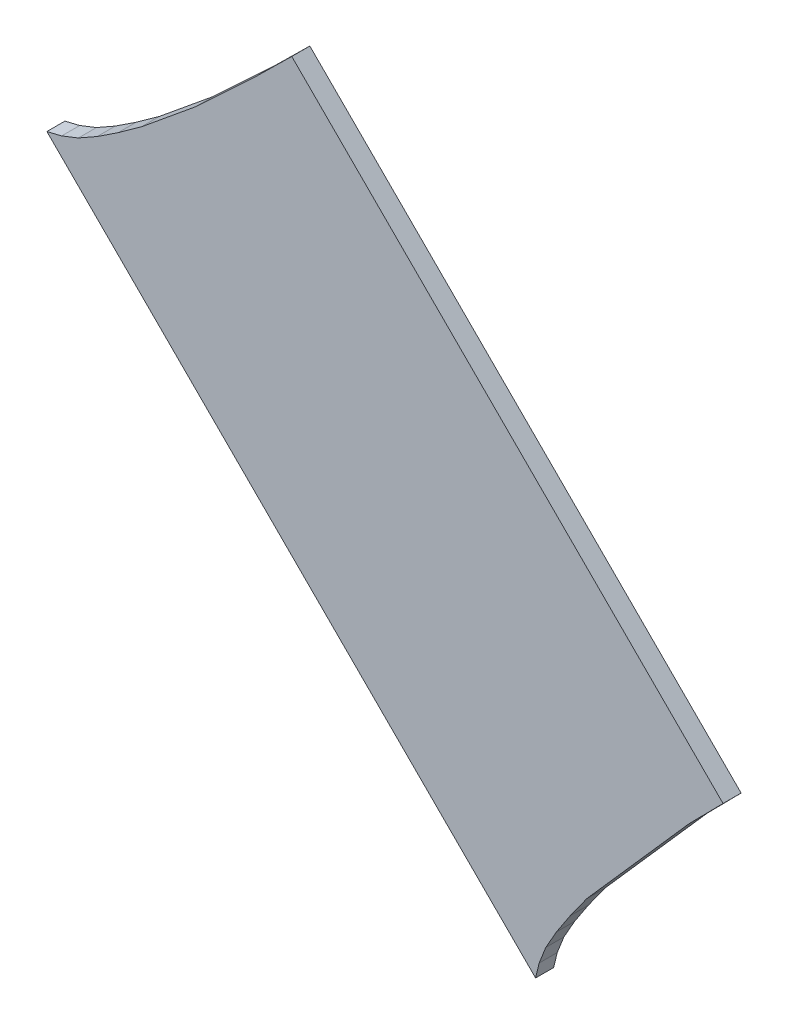
ISO-10303-21;
HEADER;
FILE_DESCRIPTION(('STEP AP214'),'2;1');
FILE_NAME('part.step','',(''),(''),'','','');
FILE_SCHEMA(('AUTOMOTIVE_DESIGN { 1 0 10303 214 1 1 1 1 }'));
ENDSEC;
DATA;
#1=APPLICATION_CONTEXT('core data for automotive mechanical design processes');
#2=APPLICATION_PROTOCOL_DEFINITION('international standard','automotive_design',2000,#1);
#3=PRODUCT_CONTEXT('',#1,'mechanical');
#4=PRODUCT('Part','Part','',(#3));
#5=PRODUCT_RELATED_PRODUCT_CATEGORY('part','',(#4));
#6=PRODUCT_DEFINITION_FORMATION('','',#4);
#7=PRODUCT_DEFINITION_CONTEXT('part definition',#1,'design');
#8=PRODUCT_DEFINITION('design','',#6,#7);
#9=PRODUCT_DEFINITION_SHAPE('','',#8);
#10=(LENGTH_UNIT() NAMED_UNIT(*) SI_UNIT(.MILLI.,.METRE.));
#11=(NAMED_UNIT(*) PLANE_ANGLE_UNIT() SI_UNIT($,.RADIAN.));
#12=(NAMED_UNIT(*) SI_UNIT($,.STERADIAN.) SOLID_ANGLE_UNIT());
#13=UNCERTAINTY_MEASURE_WITH_UNIT(LENGTH_MEASURE(1.E-05),#10,'distance_accuracy_value','');
#14=(GEOMETRIC_REPRESENTATION_CONTEXT(3) GLOBAL_UNCERTAINTY_ASSIGNED_CONTEXT((#13)) GLOBAL_UNIT_ASSIGNED_CONTEXT((#10,
#11,#12)) REPRESENTATION_CONTEXT('',''));
#15=CARTESIAN_POINT('',(0.,0.,0.));
#16=DIRECTION('',(0.,0.,1.));
#17=DIRECTION('',(1.,0.,0.));
#18=AXIS2_PLACEMENT_3D('',#15,#16,#17);
#19=CARTESIAN_POINT('',(117.662002563477,73.1510009765625,0.));
#20=DIRECTION('',(0.701852680042072,-0.712322129038373,0.));
#21=DIRECTION('',(-0.712322129038373,-0.701852680042072,0.));
#22=AXIS2_PLACEMENT_3D('',#19,#20,#21);
#23=PLANE('',#22);
#24=DIRECTION('',(-0.712322129038373,-0.701852680042072,0.));
#25=VECTOR('',#24,1.);
#26=CARTESIAN_POINT('',(117.662002563477,73.1510009765625,0.03556));
#27=LINE('',#26,#25);
#28=CARTESIAN_POINT('',(117.662002563477,73.1510009765625,0.03556));
#29=VERTEX_POINT('',#28);
#30=CARTESIAN_POINT('',(117.59400177002,73.0839996337891,0.03556));
#31=VERTEX_POINT('',#30);
#32=EDGE_CURVE('E11',#29,#31,#27,.T.);
#33=ORIENTED_EDGE('',*,*,#32,.F.);
#34=DIRECTION('',(0.,0.,1.));
#35=VECTOR('',#34,1.);
#36=CARTESIAN_POINT('',(117.662002563477,73.1510009765625,0.));
#37=LINE('',#36,#35);
#38=CARTESIAN_POINT('',(117.662002563477,73.1510009765625,0.));
#39=VERTEX_POINT('',#38);
#40=EDGE_CURVE('E24',#39,#29,#37,.T.);
#41=ORIENTED_EDGE('',*,*,#40,.F.);
#42=DIRECTION('',(-0.712322129038373,-0.701852680042072,0.));
#43=VECTOR('',#42,1.);
#44=CARTESIAN_POINT('',(117.662002563477,73.1510009765625,0.));
#45=LINE('',#44,#43);
#46=CARTESIAN_POINT('',(117.59400177002,73.0839996337891,0.));
#47=VERTEX_POINT('',#46);
#48=EDGE_CURVE('E154',#39,#47,#45,.T.);
#49=ORIENTED_EDGE('',*,*,#48,.T.);
#50=DIRECTION('',(0.,0.,1.));
#51=VECTOR('',#50,1.);
#52=CARTESIAN_POINT('',(117.59400177002,73.0839996337891,0.));
#53=LINE('',#52,#51);
#54=EDGE_CURVE('E37',#47,#31,#53,.T.);
#55=ORIENTED_EDGE('',*,*,#54,.T.);
#56=EDGE_LOOP('',(#33,#41,#49,#55));
#57=FACE_BOUND('',#56,.T.);
#58=ADVANCED_FACE('F17',(#57),#23,.F.);
#59=CARTESIAN_POINT('',(117.59400177002,73.0839996337891,0.));
#60=DIRECTION('',(0.682734905696,-0.730666167647219,0.));
#61=DIRECTION('',(-0.730666167647219,-0.682734905696,0.));
#62=AXIS2_PLACEMENT_3D('',#59,#60,#61);
#63=PLANE('',#62);
#64=DIRECTION('',(-0.730666167647219,-0.682734905696,0.));
#65=VECTOR('',#64,1.);
#66=CARTESIAN_POINT('',(117.59400177002,73.0839996337891,0.03556));
#67=LINE('',#66,#65);
#68=CARTESIAN_POINT('',(117.47200012207,72.9700012207031,0.03556));
#69=VERTEX_POINT('',#68);
#70=EDGE_CURVE('E266',#31,#69,#67,.T.);
#71=ORIENTED_EDGE('',*,*,#70,.F.);
#72=ORIENTED_EDGE('',*,*,#54,.F.);
#73=DIRECTION('',(-0.730666167647219,-0.682734905696,0.));
#74=VECTOR('',#73,1.);
#75=CARTESIAN_POINT('',(117.59400177002,73.0839996337891,0.));
#76=LINE('',#75,#74);
#77=CARTESIAN_POINT('',(117.47200012207,72.9700012207031,0.));
#78=VERTEX_POINT('',#77);
#79=EDGE_CURVE('E263',#47,#78,#76,.T.);
#80=ORIENTED_EDGE('',*,*,#79,.T.);
#81=DIRECTION('',(0.,0.,1.));
#82=VECTOR('',#81,1.);
#83=CARTESIAN_POINT('',(117.47200012207,72.9700012207031,0.));
#84=LINE('',#83,#82);
#85=EDGE_CURVE('E261',#78,#69,#84,.T.);
#86=ORIENTED_EDGE('',*,*,#85,.T.);
#87=EDGE_LOOP('',(#71,#72,#80,#86));
#88=FACE_BOUND('',#87,.T.);
#89=ADVANCED_FACE('F274',(#88),#63,.F.);
#90=CARTESIAN_POINT('',(117.47200012207,72.9700012207031,0.));
#91=DIRECTION('',(0.634409536658508,-0.772997114998974,0.));
#92=DIRECTION('',(-0.772997114998974,-0.634409536658508,0.));
#93=AXIS2_PLACEMENT_3D('',#90,#91,#92);
#94=PLANE('',#93);
#95=DIRECTION('',(-0.772997114998974,-0.634409536658508,0.));
#96=VECTOR('',#95,1.);
#97=CARTESIAN_POINT('',(117.47200012207,72.9700012207031,0.03556));
#98=LINE('',#97,#96);
#99=CARTESIAN_POINT('',(117.365997314453,72.8830032348633,0.03556));
#100=VERTEX_POINT('',#99);
#101=EDGE_CURVE('E258',#69,#100,#98,.T.);
#102=ORIENTED_EDGE('',*,*,#101,.F.);
#103=ORIENTED_EDGE('',*,*,#85,.F.);
#104=DIRECTION('',(-0.772997114998974,-0.634409536658508,0.));
#105=VECTOR('',#104,1.);
#106=CARTESIAN_POINT('',(117.47200012207,72.9700012207031,0.));
#107=LINE('',#106,#105);
#108=CARTESIAN_POINT('',(117.365997314453,72.8830032348633,0.));
#109=VERTEX_POINT('',#108);
#110=EDGE_CURVE('E255',#78,#109,#107,.T.);
#111=ORIENTED_EDGE('',*,*,#110,.T.);
#112=DIRECTION('',(0.,0.,1.));
#113=VECTOR('',#112,1.);
#114=CARTESIAN_POINT('',(117.365997314453,72.8830032348633,0.));
#115=LINE('',#114,#113);
#116=EDGE_CURVE('E253',#109,#100,#115,.T.);
#117=ORIENTED_EDGE('',*,*,#116,.T.);
#118=EDGE_LOOP('',(#102,#103,#111,#117));
#119=FACE_BOUND('',#118,.T.);
#120=ADVANCED_FACE('F280',(#119),#94,.F.);
#121=CARTESIAN_POINT('',(117.365997314453,72.8830032348633,0.));
#122=DIRECTION('',(0.582983306396356,-0.812484131822384,0.));
#123=DIRECTION('',(-0.812484131822384,-0.582983306396356,0.));
#124=AXIS2_PLACEMENT_3D('',#121,#122,#123);
#125=PLANE('',#124);
#126=DIRECTION('',(-0.812484131822384,-0.582983306396356,0.));
#127=VECTOR('',#126,1.);
#128=CARTESIAN_POINT('',(117.365997314453,72.8830032348633,0.03556));
#129=LINE('',#128,#127);
#130=CARTESIAN_POINT('',(117.319999694824,72.8499984741211,0.03556));
#131=VERTEX_POINT('',#130);
#132=EDGE_CURVE('E250',#100,#131,#129,.T.);
#133=ORIENTED_EDGE('',*,*,#132,.F.);
#134=ORIENTED_EDGE('',*,*,#116,.F.);
#135=DIRECTION('',(-0.812484131822384,-0.582983306396356,0.));
#136=VECTOR('',#135,1.);
#137=CARTESIAN_POINT('',(117.365997314453,72.8830032348633,0.));
#138=LINE('',#137,#136);
#139=CARTESIAN_POINT('',(117.319999694824,72.8499984741211,0.));
#140=VERTEX_POINT('',#139);
#141=EDGE_CURVE('E247',#109,#140,#138,.T.);
#142=ORIENTED_EDGE('',*,*,#141,.T.);
#143=DIRECTION('',(0.,0.,1.));
#144=VECTOR('',#143,1.);
#145=CARTESIAN_POINT('',(117.319999694824,72.8499984741211,0.));
#146=LINE('',#145,#144);
#147=EDGE_CURVE('E245',#140,#131,#146,.T.);
#148=ORIENTED_EDGE('',*,*,#147,.T.);
#149=EDGE_LOOP('',(#133,#134,#142,#148));
#150=FACE_BOUND('',#149,.T.);
#151=ADVANCED_FACE('F282',(#150),#125,.F.);
#152=CARTESIAN_POINT('',(117.319999694824,72.8499984741211,0.));
#153=DIRECTION('',(0.549993213403991,-0.835169123716599,0.));
#154=DIRECTION('',(-0.835169123716599,-0.549993213403991,0.));
#155=AXIS2_PLACEMENT_3D('',#152,#153,#154);
#156=PLANE('',#155);
#157=DIRECTION('',(-0.835169123716599,-0.549993213403991,0.));
#158=VECTOR('',#157,1.);
#159=CARTESIAN_POINT('',(117.319999694824,72.8499984741211,0.03556));
#160=LINE('',#159,#158);
#161=CARTESIAN_POINT('',(117.278999328613,72.822998046875,0.03556));
#162=VERTEX_POINT('',#161);
#163=EDGE_CURVE('E242',#131,#162,#160,.T.);
#164=ORIENTED_EDGE('',*,*,#163,.F.);
#165=ORIENTED_EDGE('',*,*,#147,.F.);
#166=DIRECTION('',(-0.835169123716599,-0.549993213403991,0.));
#167=VECTOR('',#166,1.);
#168=CARTESIAN_POINT('',(117.319999694824,72.8499984741211,0.));
#169=LINE('',#168,#167);
#170=CARTESIAN_POINT('',(117.278999328613,72.822998046875,0.));
#171=VERTEX_POINT('',#170);
#172=EDGE_CURVE('E239',#140,#171,#169,.T.);
#173=ORIENTED_EDGE('',*,*,#172,.T.);
#174=DIRECTION('',(0.,0.,1.));
#175=VECTOR('',#174,1.);
#176=CARTESIAN_POINT('',(117.278999328613,72.822998046875,0.));
#177=LINE('',#176,#175);
#178=EDGE_CURVE('E237',#171,#162,#177,.T.);
#179=ORIENTED_EDGE('',*,*,#178,.T.);
#180=EDGE_LOOP('',(#164,#165,#173,#179));
#181=FACE_BOUND('',#180,.T.);
#182=ADVANCED_FACE('F287',(#181),#156,.F.);
#183=CARTESIAN_POINT('',(117.278999328613,72.822998046875,0.));
#184=DIRECTION('',(0.49351020523534,-0.869740005592805,0.));
#185=DIRECTION('',(-0.869740005592805,-0.49351020523534,0.));
#186=AXIS2_PLACEMENT_3D('',#183,#184,#185);
#187=PLANE('',#186);
#188=DIRECTION('',(-0.869740005592805,-0.49351020523534,0.));
#189=VECTOR('',#188,1.);
#190=CARTESIAN_POINT('',(117.278999328613,72.822998046875,0.03556));
#191=LINE('',#190,#189);
#192=CARTESIAN_POINT('',(117.241996765137,72.802001953125,0.03556));
#193=VERTEX_POINT('',#192);
#194=EDGE_CURVE('E234',#162,#193,#191,.T.);
#195=ORIENTED_EDGE('',*,*,#194,.F.);
#196=ORIENTED_EDGE('',*,*,#178,.F.);
#197=DIRECTION('',(-0.869740005592805,-0.49351020523534,0.));
#198=VECTOR('',#197,1.);
#199=CARTESIAN_POINT('',(117.278999328613,72.822998046875,0.));
#200=LINE('',#199,#198);
#201=CARTESIAN_POINT('',(117.241996765137,72.802001953125,0.));
#202=VERTEX_POINT('',#201);
#203=EDGE_CURVE('E231',#171,#202,#200,.T.);
#204=ORIENTED_EDGE('',*,*,#203,.T.);
#205=DIRECTION('',(0.,0.,1.));
#206=VECTOR('',#205,1.);
#207=CARTESIAN_POINT('',(117.241996765137,72.802001953125,0.));
#208=LINE('',#207,#206);
#209=EDGE_CURVE('E229',#202,#193,#208,.T.);
#210=ORIENTED_EDGE('',*,*,#209,.T.);
#211=EDGE_LOOP('',(#195,#196,#204,#210));
#212=FACE_BOUND('',#211,.T.);
#213=ADVANCED_FACE('F290',(#212),#187,.F.);
#214=CARTESIAN_POINT('',(117.241996765137,72.802001953125,0.));
#215=DIRECTION('',(0.366564019369772,-0.93039283085344,0.));
#216=DIRECTION('',(-0.93039283085344,-0.366564019369772,0.));
#217=AXIS2_PLACEMENT_3D('',#214,#215,#216);
#218=PLANE('',#217);
#219=DIRECTION('',(-0.93039283085344,-0.366564019369772,0.));
#220=VECTOR('',#219,1.);
#221=CARTESIAN_POINT('',(117.241996765137,72.802001953125,0.03556));
#222=LINE('',#221,#220);
#223=CARTESIAN_POINT('',(117.208999633789,72.7890014648438,0.03556));
#224=VERTEX_POINT('',#223);
#225=EDGE_CURVE('E226',#193,#224,#222,.T.);
#226=ORIENTED_EDGE('',*,*,#225,.F.);
#227=ORIENTED_EDGE('',*,*,#209,.F.);
#228=DIRECTION('',(-0.93039283085344,-0.366564019369772,0.));
#229=VECTOR('',#228,1.);
#230=CARTESIAN_POINT('',(117.241996765137,72.802001953125,0.));
#231=LINE('',#230,#229);
#232=CARTESIAN_POINT('',(117.208999633789,72.7890014648438,0.));
#233=VERTEX_POINT('',#232);
#234=EDGE_CURVE('E223',#202,#233,#231,.T.);
#235=ORIENTED_EDGE('',*,*,#234,.T.);
#236=DIRECTION('',(0.,0.,1.));
#237=VECTOR('',#236,1.);
#238=CARTESIAN_POINT('',(117.208999633789,72.7890014648438,0.));
#239=LINE('',#238,#237);
#240=EDGE_CURVE('E221',#233,#224,#239,.T.);
#241=ORIENTED_EDGE('',*,*,#240,.T.);
#242=EDGE_LOOP('',(#226,#227,#235,#241));
#243=FACE_BOUND('',#242,.T.);
#244=ADVANCED_FACE('F295',(#243),#218,.F.);
#245=CARTESIAN_POINT('',(117.208999633789,72.7890014648438,0.));
#246=DIRECTION('',(0.234765525660795,-0.972052029451722,0.));
#247=DIRECTION('',(-0.972052029451722,-0.234765525660795,0.));
#248=AXIS2_PLACEMENT_3D('',#245,#246,#247);
#249=PLANE('',#248);
#250=DIRECTION('',(-0.972052029451722,-0.234765525660795,0.));
#251=VECTOR('',#250,1.);
#252=CARTESIAN_POINT('',(117.208999633789,72.7890014648438,0.03556));
#253=LINE('',#252,#251);
#254=CARTESIAN_POINT('',(117.180000305176,72.7819976806641,0.03556));
#255=VERTEX_POINT('',#254);
#256=EDGE_CURVE('E218',#224,#255,#253,.T.);
#257=ORIENTED_EDGE('',*,*,#256,.F.);
#258=ORIENTED_EDGE('',*,*,#240,.F.);
#259=DIRECTION('',(-0.972052029451722,-0.234765525660795,0.));
#260=VECTOR('',#259,1.);
#261=CARTESIAN_POINT('',(117.208999633789,72.7890014648438,0.));
#262=LINE('',#261,#260);
#263=CARTESIAN_POINT('',(117.180000305176,72.7819976806641,0.));
#264=VERTEX_POINT('',#263);
#265=EDGE_CURVE('E215',#233,#264,#262,.T.);
#266=ORIENTED_EDGE('',*,*,#265,.T.);
#267=DIRECTION('',(0.,0.,1.));
#268=VECTOR('',#267,1.);
#269=CARTESIAN_POINT('',(117.180000305176,72.7819976806641,0.));
#270=LINE('',#269,#268);
#271=EDGE_CURVE('E213',#264,#255,#270,.T.);
#272=ORIENTED_EDGE('',*,*,#271,.T.);
#273=EDGE_LOOP('',(#257,#258,#266,#272));
#274=FACE_BOUND('',#273,.T.);
#275=ADVANCED_FACE('F298',(#274),#249,.F.);
#276=CARTESIAN_POINT('',(117.180000305176,72.7819976806641,0.));
#277=DIRECTION('',(0.707106781186548,0.707106781186548,0.));
#278=DIRECTION('',(0.707106781186548,-0.707106781186548,0.));
#279=AXIS2_PLACEMENT_3D('',#276,#277,#278);
#280=PLANE('',#279);
#281=DIRECTION('',(0.707106781186548,-0.707106781186548,0.));
#282=VECTOR('',#281,1.);
#283=CARTESIAN_POINT('',(117.180000305176,72.7819976806641,0.03556));
#284=LINE('',#283,#282);
#285=CARTESIAN_POINT('',(118.141998291016,71.8199996948242,0.03556));
#286=VERTEX_POINT('',#285);
#287=EDGE_CURVE('E210',#255,#286,#284,.T.);
#288=ORIENTED_EDGE('',*,*,#287,.F.);
#289=ORIENTED_EDGE('',*,*,#271,.F.);
#290=DIRECTION('',(0.707106781186548,-0.707106781186548,0.));
#291=VECTOR('',#290,1.);
#292=CARTESIAN_POINT('',(117.180000305176,72.7819976806641,0.));
#293=LINE('',#292,#291);
#294=CARTESIAN_POINT('',(118.141998291016,71.8199996948242,0.));
#295=VERTEX_POINT('',#294);
#296=EDGE_CURVE('E207',#264,#295,#293,.T.);
#297=ORIENTED_EDGE('',*,*,#296,.T.);
#298=DIRECTION('',(0.,0.,1.));
#299=VECTOR('',#298,1.);
#300=CARTESIAN_POINT('',(118.141998291016,71.8199996948242,0.));
#301=LINE('',#300,#299);
#302=EDGE_CURVE('E205',#295,#286,#301,.T.);
#303=ORIENTED_EDGE('',*,*,#302,.T.);
#304=EDGE_LOOP('',(#288,#289,#297,#303));
#305=FACE_BOUND('',#304,.T.);
#306=ADVANCED_FACE('F303',(#305),#280,.F.);
#307=CARTESIAN_POINT('',(118.141998291016,71.8199996948242,0.));
#308=DIRECTION('',(-0.972052029451722,0.234765525660795,0.));
#309=DIRECTION('',(0.234765525660795,0.972052029451722,0.));
#310=AXIS2_PLACEMENT_3D('',#307,#308,#309);
#311=PLANE('',#310);
#312=DIRECTION('',(0.234765525660795,0.972052029451722,0.));
#313=VECTOR('',#312,1.);
#314=CARTESIAN_POINT('',(118.141998291016,71.8199996948242,0.03556));
#315=LINE('',#314,#313);
#316=CARTESIAN_POINT('',(118.149002075195,71.8489990234375,0.03556));
#317=VERTEX_POINT('',#316);
#318=EDGE_CURVE('E202',#286,#317,#315,.T.);
#319=ORIENTED_EDGE('',*,*,#318,.F.);
#320=ORIENTED_EDGE('',*,*,#302,.F.);
#321=DIRECTION('',(0.234765525660795,0.972052029451722,0.));
#322=VECTOR('',#321,1.);
#323=CARTESIAN_POINT('',(118.141998291016,71.8199996948242,0.));
#324=LINE('',#323,#322);
#325=CARTESIAN_POINT('',(118.149002075195,71.8489990234375,0.));
#326=VERTEX_POINT('',#325);
#327=EDGE_CURVE('E199',#295,#326,#324,.T.);
#328=ORIENTED_EDGE('',*,*,#327,.T.);
#329=DIRECTION('',(0.,0.,1.));
#330=VECTOR('',#329,1.);
#331=CARTESIAN_POINT('',(118.149002075195,71.8489990234375,0.));
#332=LINE('',#331,#330);
#333=EDGE_CURVE('E197',#326,#317,#332,.T.);
#334=ORIENTED_EDGE('',*,*,#333,.T.);
#335=EDGE_LOOP('',(#319,#320,#328,#334));
#336=FACE_BOUND('',#335,.T.);
#337=ADVANCED_FACE('F306',(#336),#311,.F.);
#338=CARTESIAN_POINT('',(118.149002075195,71.8489990234375,0.));
#339=DIRECTION('',(-0.930421727639445,0.366490666642999,0.));
#340=DIRECTION('',(0.366490666642999,0.930421727639445,0.));
#341=AXIS2_PLACEMENT_3D('',#338,#339,#340);
#342=PLANE('',#341);
#343=DIRECTION('',(0.366490666642999,0.930421727639445,0.));
#344=VECTOR('',#343,1.);
#345=CARTESIAN_POINT('',(118.149002075195,71.8489990234375,0.03556));
#346=LINE('',#345,#344);
#347=CARTESIAN_POINT('',(118.162002563477,71.8820037841797,0.03556));
#348=VERTEX_POINT('',#347);
#349=EDGE_CURVE('E194',#317,#348,#346,.T.);
#350=ORIENTED_EDGE('',*,*,#349,.F.);
#351=ORIENTED_EDGE('',*,*,#333,.F.);
#352=DIRECTION('',(0.366490666642999,0.930421727639445,0.));
#353=VECTOR('',#352,1.);
#354=CARTESIAN_POINT('',(118.149002075195,71.8489990234375,0.));
#355=LINE('',#354,#353);
#356=CARTESIAN_POINT('',(118.162002563477,71.8820037841797,0.));
#357=VERTEX_POINT('',#356);
#358=EDGE_CURVE('E191',#326,#357,#355,.T.);
#359=ORIENTED_EDGE('',*,*,#358,.T.);
#360=DIRECTION('',(0.,0.,1.));
#361=VECTOR('',#360,1.);
#362=CARTESIAN_POINT('',(118.162002563477,71.8820037841797,0.));
#363=LINE('',#362,#361);
#364=EDGE_CURVE('E189',#357,#348,#363,.T.);
#365=ORIENTED_EDGE('',*,*,#364,.T.);
#366=EDGE_LOOP('',(#350,#351,#359,#365));
#367=FACE_BOUND('',#366,.T.);
#368=ADVANCED_FACE('F311',(#367),#342,.F.);
#369=CARTESIAN_POINT('',(118.162002563477,71.8820037841797,0.));
#370=DIRECTION('',(-0.869696319661765,0.493587187401356,0.));
#371=DIRECTION('',(0.493587187401356,0.869696319661765,0.));
#372=AXIS2_PLACEMENT_3D('',#369,#370,#371);
#373=PLANE('',#372);
#374=DIRECTION('',(0.493587187401356,0.869696319661765,0.));
#375=VECTOR('',#374,1.);
#376=CARTESIAN_POINT('',(118.162002563477,71.8820037841797,0.03556));
#377=LINE('',#376,#375);
#378=CARTESIAN_POINT('',(118.182998657227,71.9189987182617,0.03556));
#379=VERTEX_POINT('',#378);
#380=EDGE_CURVE('E186',#348,#379,#377,.T.);
#381=ORIENTED_EDGE('',*,*,#380,.F.);
#382=ORIENTED_EDGE('',*,*,#364,.F.);
#383=DIRECTION('',(0.493587187401356,0.869696319661765,0.));
#384=VECTOR('',#383,1.);
#385=CARTESIAN_POINT('',(118.162002563477,71.8820037841797,0.));
#386=LINE('',#385,#384);
#387=CARTESIAN_POINT('',(118.182998657227,71.9189987182617,0.));
#388=VERTEX_POINT('',#387);
#389=EDGE_CURVE('E183',#357,#388,#386,.T.);
#390=ORIENTED_EDGE('',*,*,#389,.T.);
#391=DIRECTION('',(0.,0.,1.));
#392=VECTOR('',#391,1.);
#393=CARTESIAN_POINT('',(118.182998657227,71.9189987182617,0.));
#394=LINE('',#393,#392);
#395=EDGE_CURVE('E181',#388,#379,#394,.T.);
#396=ORIENTED_EDGE('',*,*,#395,.T.);
#397=EDGE_LOOP('',(#381,#382,#390,#396));
#398=FACE_BOUND('',#397,.T.);
#399=ADVANCED_FACE('F314',(#398),#373,.F.);
#400=CARTESIAN_POINT('',(118.182998657227,71.9189987182617,0.));
#401=DIRECTION('',(-0.835169123716599,0.549993213403991,0.));
#402=DIRECTION('',(0.549993213403991,0.835169123716599,0.));
#403=AXIS2_PLACEMENT_3D('',#400,#401,#402);
#404=PLANE('',#403);
#405=DIRECTION('',(0.549993213403991,0.835169123716599,0.));
#406=VECTOR('',#405,1.);
#407=CARTESIAN_POINT('',(118.182998657227,71.9189987182617,0.03556));
#408=LINE('',#407,#406);
#409=CARTESIAN_POINT('',(118.209999084473,71.9599990844727,0.03556));
#410=VERTEX_POINT('',#409);
#411=EDGE_CURVE('E178',#379,#410,#408,.T.);
#412=ORIENTED_EDGE('',*,*,#411,.F.);
#413=ORIENTED_EDGE('',*,*,#395,.F.);
#414=DIRECTION('',(0.549993213403991,0.835169123716599,0.));
#415=VECTOR('',#414,1.);
#416=CARTESIAN_POINT('',(118.182998657227,71.9189987182617,0.));
#417=LINE('',#416,#415);
#418=CARTESIAN_POINT('',(118.209999084473,71.9599990844727,0.));
#419=VERTEX_POINT('',#418);
#420=EDGE_CURVE('E175',#388,#419,#417,.T.);
#421=ORIENTED_EDGE('',*,*,#420,.T.);
#422=DIRECTION('',(0.,0.,1.));
#423=VECTOR('',#422,1.);
#424=CARTESIAN_POINT('',(118.209999084473,71.9599990844727,0.));
#425=LINE('',#424,#423);
#426=EDGE_CURVE('E173',#419,#410,#425,.T.);
#427=ORIENTED_EDGE('',*,*,#426,.T.);
#428=EDGE_LOOP('',(#412,#413,#421,#427));
#429=FACE_BOUND('',#428,.T.);
#430=ADVANCED_FACE('F319',(#429),#404,.F.);
#431=CARTESIAN_POINT('',(118.209999084473,71.9599990844727,0.));
#432=DIRECTION('',(-0.812547964283568,0.582894334968723,0.));
#433=DIRECTION('',(0.582894334968723,0.812547964283568,0.));
#434=AXIS2_PLACEMENT_3D('',#431,#432,#433);
#435=PLANE('',#434);
#436=DIRECTION('',(0.582894334968723,0.812547964283568,0.));
#437=VECTOR('',#436,1.);
#438=CARTESIAN_POINT('',(118.209999084473,71.9599990844727,0.03556));
#439=LINE('',#438,#437);
#440=CARTESIAN_POINT('',(118.24299621582,72.0059967041016,0.03556));
#441=VERTEX_POINT('',#440);
#442=EDGE_CURVE('E170',#410,#441,#439,.T.);
#443=ORIENTED_EDGE('',*,*,#442,.F.);
#444=ORIENTED_EDGE('',*,*,#426,.F.);
#445=DIRECTION('',(0.582894334968723,0.812547964283568,0.));
#446=VECTOR('',#445,1.);
#447=CARTESIAN_POINT('',(118.209999084473,71.9599990844727,0.));
#448=LINE('',#447,#446);
#449=CARTESIAN_POINT('',(118.24299621582,72.0059967041016,0.));
#450=VERTEX_POINT('',#449);
#451=EDGE_CURVE('E167',#419,#450,#448,.T.);
#452=ORIENTED_EDGE('',*,*,#451,.T.);
#453=DIRECTION('',(0.,0.,1.));
#454=VECTOR('',#453,1.);
#455=CARTESIAN_POINT('',(118.24299621582,72.0059967041016,0.));
#456=LINE('',#455,#454);
#457=EDGE_CURVE('E165',#450,#441,#456,.T.);
#458=ORIENTED_EDGE('',*,*,#457,.T.);
#459=EDGE_LOOP('',(#443,#444,#452,#458));
#460=FACE_BOUND('',#459,.T.);
#461=ADVANCED_FACE('F322',(#460),#435,.F.);
#462=CARTESIAN_POINT('',(118.24299621582,72.0059967041016,0.));
#463=DIRECTION('',(-0.750125657730338,0.661295318004466,0.));
#464=DIRECTION('',(0.661295318004466,0.750125657730338,0.));
#465=AXIS2_PLACEMENT_3D('',#462,#463,#464);
#466=PLANE('',#465);
#467=DIRECTION('',(0.661295318004466,0.750125657730338,0.));
#468=VECTOR('',#467,1.);
#469=CARTESIAN_POINT('',(118.24299621582,72.0059967041016,0.03556));
#470=LINE('',#469,#468);
#471=CARTESIAN_POINT('',(118.444000244141,72.234001159668,0.03556));
#472=VERTEX_POINT('',#471);
#473=EDGE_CURVE('E162',#441,#472,#470,.T.);
#474=ORIENTED_EDGE('',*,*,#473,.F.);
#475=ORIENTED_EDGE('',*,*,#457,.F.);
#476=DIRECTION('',(0.661295318004466,0.750125657730338,0.));
#477=VECTOR('',#476,1.);
#478=CARTESIAN_POINT('',(118.24299621582,72.0059967041016,0.));
#479=LINE('',#478,#477);
#480=CARTESIAN_POINT('',(118.444000244141,72.234001159668,0.));
#481=VERTEX_POINT('',#480);
#482=EDGE_CURVE('E160',#450,#481,#479,.T.);
#483=ORIENTED_EDGE('',*,*,#482,.T.);
#484=DIRECTION('',(0.,0.,1.));
#485=VECTOR('',#484,1.);
#486=CARTESIAN_POINT('',(118.444000244141,72.234001159668,0.));
#487=LINE('',#486,#485);
#488=EDGE_CURVE('E145',#481,#472,#487,.T.);
#489=ORIENTED_EDGE('',*,*,#488,.T.);
#490=EDGE_LOOP('',(#474,#475,#483,#489));
#491=FACE_BOUND('',#490,.T.);
#492=ADVANCED_FACE('F325',(#491),#466,.F.);
#493=CARTESIAN_POINT('',(118.444000244141,72.234001159668,0.));
#494=DIRECTION('',(-0.712322129038373,0.701852680042072,0.));
#495=DIRECTION('',(0.701852680042072,0.712322129038373,0.));
#496=AXIS2_PLACEMENT_3D('',#493,#494,#495);
#497=PLANE('',#496);
#498=DIRECTION('',(0.701852680042072,0.712322129038373,0.));
#499=VECTOR('',#498,1.);
#500=CARTESIAN_POINT('',(118.444000244141,72.234001159668,0.03556));
#501=LINE('',#500,#499);
#502=CARTESIAN_POINT('',(118.511001586914,72.302001953125,0.03556));
#503=VERTEX_POINT('',#502);
#504=EDGE_CURVE('E149',#472,#503,#501,.T.);
#505=ORIENTED_EDGE('',*,*,#504,.F.);
#506=ORIENTED_EDGE('',*,*,#488,.F.);
#507=DIRECTION('',(0.701852680042072,0.712322129038373,0.));
#508=VECTOR('',#507,1.);
#509=CARTESIAN_POINT('',(118.444000244141,72.234001159668,0.));
#510=LINE('',#509,#508);
#511=CARTESIAN_POINT('',(118.511001586914,72.302001953125,0.));
#512=VERTEX_POINT('',#511);
#513=EDGE_CURVE('E141',#481,#512,#510,.T.);
#514=ORIENTED_EDGE('',*,*,#513,.T.);
#515=DIRECTION('',(0.,0.,1.));
#516=VECTOR('',#515,1.);
#517=CARTESIAN_POINT('',(118.511001586914,72.302001953125,0.));
#518=LINE('',#517,#516);
#519=EDGE_CURVE('E131',#512,#503,#518,.T.);
#520=ORIENTED_EDGE('',*,*,#519,.T.);
#521=EDGE_LOOP('',(#505,#506,#514,#520));
#522=FACE_BOUND('',#521,.T.);
#523=ADVANCED_FACE('F144',(#522),#497,.F.);
#524=CARTESIAN_POINT('',(118.511001586914,72.302001953125,0.));
#525=DIRECTION('',(-0.707106781186548,-0.707106781186548,0.));
#526=DIRECTION('',(-0.707106781186548,0.707106781186548,0.));
#527=AXIS2_PLACEMENT_3D('',#524,#525,#526);
#528=PLANE('',#527);
#529=DIRECTION('',(-0.707106781186548,0.707106781186548,0.));
#530=VECTOR('',#529,1.);
#531=CARTESIAN_POINT('',(118.511001586914,72.302001953125,0.03556));
#532=LINE('',#531,#530);
#533=EDGE_CURVE('E137',#503,#29,#532,.T.);
#534=ORIENTED_EDGE('',*,*,#533,.F.);
#535=ORIENTED_EDGE('',*,*,#519,.F.);
#536=DIRECTION('',(-0.707106781186548,0.707106781186548,0.));
#537=VECTOR('',#536,1.);
#538=CARTESIAN_POINT('',(118.511001586914,72.302001953125,0.));
#539=LINE('',#538,#537);
#540=EDGE_CURVE('E135',#512,#39,#539,.T.);
#541=ORIENTED_EDGE('',*,*,#540,.T.);
#542=ORIENTED_EDGE('',*,*,#40,.T.);
#543=EDGE_LOOP('',(#534,#535,#541,#542));
#544=FACE_BOUND('',#543,.T.);
#545=ADVANCED_FACE('F133',(#544),#528,.F.);
#546=CARTESIAN_POINT('',(117.662002563477,73.1510009765625,0.));
#547=DIRECTION('',(0.,0.,1.));
#548=DIRECTION('',(1.,0.,0.));
#549=AXIS2_PLACEMENT_3D('',#546,#547,#548);
#550=PLANE('',#549);
#551=ORIENTED_EDGE('',*,*,#540,.F.);
#552=ORIENTED_EDGE('',*,*,#513,.F.);
#553=ORIENTED_EDGE('',*,*,#482,.F.);
#554=ORIENTED_EDGE('',*,*,#451,.F.);
#555=ORIENTED_EDGE('',*,*,#420,.F.);
#556=ORIENTED_EDGE('',*,*,#389,.F.);
#557=ORIENTED_EDGE('',*,*,#358,.F.);
#558=ORIENTED_EDGE('',*,*,#327,.F.);
#559=ORIENTED_EDGE('',*,*,#296,.F.);
#560=ORIENTED_EDGE('',*,*,#265,.F.);
#561=ORIENTED_EDGE('',*,*,#234,.F.);
#562=ORIENTED_EDGE('',*,*,#203,.F.);
#563=ORIENTED_EDGE('',*,*,#172,.F.);
#564=ORIENTED_EDGE('',*,*,#141,.F.);
#565=ORIENTED_EDGE('',*,*,#110,.F.);
#566=ORIENTED_EDGE('',*,*,#79,.F.);
#567=ORIENTED_EDGE('',*,*,#48,.F.);
#568=EDGE_LOOP('',(#551,#552,#553,#554,#555,#556,#557,#558,#559,#560,#561,#562,#563,#564,#565,
#566,#567));
#569=FACE_BOUND('',#568,.T.);
#570=ADVANCED_FACE('F152',(#569),#550,.F.);
#571=CARTESIAN_POINT('',(117.662002563477,73.1510009765625,0.03556));
#572=DIRECTION('',(0.,0.,1.));
#573=DIRECTION('',(1.,0.,0.));
#574=AXIS2_PLACEMENT_3D('',#571,#572,#573);
#575=PLANE('',#574);
#576=ORIENTED_EDGE('',*,*,#32,.T.);
#577=ORIENTED_EDGE('',*,*,#70,.T.);
#578=ORIENTED_EDGE('',*,*,#101,.T.);
#579=ORIENTED_EDGE('',*,*,#132,.T.);
#580=ORIENTED_EDGE('',*,*,#163,.T.);
#581=ORIENTED_EDGE('',*,*,#194,.T.);
#582=ORIENTED_EDGE('',*,*,#225,.T.);
#583=ORIENTED_EDGE('',*,*,#256,.T.);
#584=ORIENTED_EDGE('',*,*,#287,.T.);
#585=ORIENTED_EDGE('',*,*,#318,.T.);
#586=ORIENTED_EDGE('',*,*,#349,.T.);
#587=ORIENTED_EDGE('',*,*,#380,.T.);
#588=ORIENTED_EDGE('',*,*,#411,.T.);
#589=ORIENTED_EDGE('',*,*,#442,.T.);
#590=ORIENTED_EDGE('',*,*,#473,.T.);
#591=ORIENTED_EDGE('',*,*,#504,.T.);
#592=ORIENTED_EDGE('',*,*,#533,.T.);
#593=EDGE_LOOP('',(#576,#577,#578,#579,#580,#581,#582,#583,#584,#585,#586,#587,#588,#589,#590,
#591,#592));
#594=FACE_BOUND('',#593,.T.);
#595=ADVANCED_FACE('F277',(#594),#575,.T.);
#596=CLOSED_SHELL('',(#58,#89,#120,#151,#182,#213,#244,#275,#306,#337,#368,#399,#430,#461,#492,
#523,#545,#570,#595));
#597=MANIFOLD_SOLID_BREP('B1',#596);
#598=ADVANCED_BREP_SHAPE_REPRESENTATION('',(#18,#597),#14);
#599=SHAPE_DEFINITION_REPRESENTATION(#9,#598);
ENDSEC;
END-ISO-10303-21;
